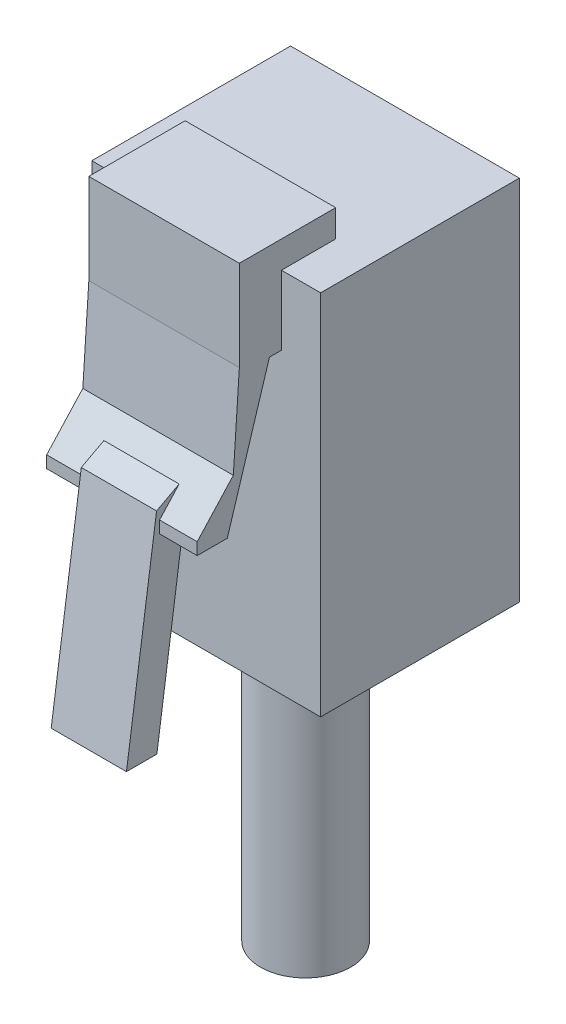
ISO-10303-21;
HEADER;
FILE_DESCRIPTION(('STEP AP214'),'2;1');
FILE_NAME('part.step','',(''),(''),'','','');
FILE_SCHEMA(('AUTOMOTIVE_DESIGN { 1 0 10303 214 1 1 1 1 }'));
ENDSEC;
DATA;
#1=APPLICATION_CONTEXT('core data for automotive mechanical design processes');
#2=APPLICATION_PROTOCOL_DEFINITION('international standard','automotive_design',2000,#1);
#3=PRODUCT_CONTEXT('',#1,'mechanical');
#4=PRODUCT('Part','Part','',(#3));
#5=PRODUCT_RELATED_PRODUCT_CATEGORY('part','',(#4));
#6=PRODUCT_DEFINITION_FORMATION('','',#4);
#7=PRODUCT_DEFINITION_CONTEXT('part definition',#1,'design');
#8=PRODUCT_DEFINITION('design','',#6,#7);
#9=PRODUCT_DEFINITION_SHAPE('','',#8);
#10=(LENGTH_UNIT() NAMED_UNIT(*) SI_UNIT(.MILLI.,.METRE.));
#11=(NAMED_UNIT(*) PLANE_ANGLE_UNIT() SI_UNIT($,.RADIAN.));
#12=(NAMED_UNIT(*) SI_UNIT($,.STERADIAN.) SOLID_ANGLE_UNIT());
#13=UNCERTAINTY_MEASURE_WITH_UNIT(LENGTH_MEASURE(1.E-05),#10,'distance_accuracy_value','');
#14=(GEOMETRIC_REPRESENTATION_CONTEXT(3) GLOBAL_UNCERTAINTY_ASSIGNED_CONTEXT((#13)) GLOBAL_UNIT_ASSIGNED_CONTEXT((#10,
#11,#12)) REPRESENTATION_CONTEXT('',''));
#15=CARTESIAN_POINT('',(0.,0.,0.));
#16=DIRECTION('',(0.,0.,1.));
#17=DIRECTION('',(1.,0.,0.));
#18=AXIS2_PLACEMENT_3D('',#15,#16,#17);
#19=CARTESIAN_POINT('',(-1.25,-7.,7.2));
#20=DIRECTION('',(0.,-1.,0.));
#21=DIRECTION('',(0.,0.,-1.));
#22=AXIS2_PLACEMENT_3D('',#19,#20,#21);
#23=PLANE('',#22);
#24=DIRECTION('',(1.,0.,0.));
#25=VECTOR('',#24,1.);
#26=CARTESIAN_POINT('',(-1.25,-7.,6.189847455448));
#27=LINE('',#26,#25);
#28=CARTESIAN_POINT('',(1.25,-7.,6.189847455448));
#29=VERTEX_POINT('',#28);
#30=CARTESIAN_POINT('',(-1.25,-7.,6.189847455448));
#31=VERTEX_POINT('',#30);
#32=EDGE_CURVE('E303',#29,#31,#27,.F.);
#33=ORIENTED_EDGE('',*,*,#32,.F.);
#34=DIRECTION('',(0.,0.,-1.));
#35=VECTOR('',#34,1.);
#36=CARTESIAN_POINT('',(1.25,-7.,0.));
#37=LINE('',#36,#35);
#38=CARTESIAN_POINT('',(1.25,-7.00000000000001,7.19999999999996));
#39=VERTEX_POINT('',#38);
#40=EDGE_CURVE('E315',#39,#29,#37,.T.);
#41=ORIENTED_EDGE('',*,*,#40,.F.);
#42=DIRECTION('',(1.,0.,0.));
#43=VECTOR('',#42,1.);
#44=CARTESIAN_POINT('',(-1.25,-7.00000000000002,7.1999999999999));
#45=LINE('',#44,#43);
#46=CARTESIAN_POINT('',(-1.25,-7.00000000000001,7.19999999999996));
#47=VERTEX_POINT('',#46);
#48=EDGE_CURVE('E308',#47,#39,#45,.T.);
#49=ORIENTED_EDGE('',*,*,#48,.F.);
#50=DIRECTION('',(0.,0.,-1.));
#51=VECTOR('',#50,1.);
#52=CARTESIAN_POINT('',(-1.25,-7.,0.));
#53=LINE('',#52,#51);
#54=EDGE_CURVE('E325',#47,#31,#53,.T.);
#55=ORIENTED_EDGE('',*,*,#54,.T.);
#56=EDGE_LOOP('',(#33,#41,#49,#55));
#57=FACE_BOUND('',#56,.T.);
#58=ADVANCED_FACE('F16',(#57),#23,.T.);
#59=CARTESIAN_POINT('',(-1.25,0.,0.));
#60=DIRECTION('',(1.,0.,0.));
#61=DIRECTION('',(0.,0.,-1.));
#62=AXIS2_PLACEMENT_3D('',#59,#60,#61);
#63=PLANE('',#62);
#64=DIRECTION('',(0.,0.989949493661169,-0.141421356237296));
#65=VECTOR('',#64,1.);
#66=CARTESIAN_POINT('',(-1.25,-7.,6.189847455448));
#67=LINE('',#66,#65);
#68=CARTESIAN_POINT('',(-1.25,-0.709999999999966,5.29127602687628));
#69=VERTEX_POINT('',#68);
#70=EDGE_CURVE('E300',#31,#69,#67,.T.);
#71=ORIENTED_EDGE('',*,*,#70,.F.);
#72=ORIENTED_EDGE('',*,*,#54,.F.);
#73=DIRECTION('',(0.,-0.989949493661169,0.141421356237296));
#74=VECTOR('',#73,1.);
#75=CARTESIAN_POINT('',(-1.25,0.,6.2));
#76=LINE('',#75,#74);
#77=CARTESIAN_POINT('',(-1.25,0.,6.20000000000003));
#78=VERTEX_POINT('',#77);
#79=EDGE_CURVE('E310',#78,#47,#76,.T.);
#80=ORIENTED_EDGE('',*,*,#79,.F.);
#81=DIRECTION('',(0.,-0.47045341325235,0.88242483303634));
#82=VECTOR('',#81,1.);
#83=CARTESIAN_POINT('',(-1.25,0.400110059428995,5.44951750281307));
#84=LINE('',#83,#82);
#85=CARTESIAN_POINT('',(-1.25,0.400110059429046,5.4495175028131));
#86=VERTEX_POINT('',#85);
#87=EDGE_CURVE('E170',#86,#78,#84,.T.);
#88=ORIENTED_EDGE('',*,*,#87,.F.);
#89=DIRECTION('',(0.,0.737387749170632,-0.675469693896824));
#90=VECTOR('',#89,1.);
#91=CARTESIAN_POINT('',(-1.25,-0.310000000000005,6.09999999999999));
#92=LINE('',#91,#90);
#93=CARTESIAN_POINT('',(-1.25,-0.310000000000012,6.09999999999999));
#94=VERTEX_POINT('',#93);
#95=EDGE_CURVE('E165',#94,#86,#92,.T.);
#96=ORIENTED_EDGE('',*,*,#95,.F.);
#97=DIRECTION('',(0.,1.,0.));
#98=VECTOR('',#97,1.);
#99=CARTESIAN_POINT('',(-1.25,0.,6.1));
#100=LINE('',#99,#98);
#101=CARTESIAN_POINT('',(-1.25,-0.709999999999988,6.1));
#102=VERTEX_POINT('',#101);
#103=EDGE_CURVE('E162',#102,#94,#100,.T.);
#104=ORIENTED_EDGE('',*,*,#103,.F.);
#105=DIRECTION('',(0.,0.,-1.));
#106=VECTOR('',#105,1.);
#107=CARTESIAN_POINT('',(-1.25,-0.709999999999977,0.));
#108=LINE('',#107,#106);
#109=EDGE_CURVE('E323',#69,#102,#108,.F.);
#110=ORIENTED_EDGE('',*,*,#109,.F.);
#111=EDGE_LOOP('',(#71,#72,#80,#88,#96,#104,#110));
#112=FACE_BOUND('',#111,.T.);
#113=ADVANCED_FACE('F168',(#112),#63,.F.);
#114=CARTESIAN_POINT('',(1.25,0.,0.));
#115=DIRECTION('',(1.,0.,0.));
#116=DIRECTION('',(0.,0.,-1.));
#117=AXIS2_PLACEMENT_3D('',#114,#115,#116);
#118=PLANE('',#117);
#119=DIRECTION('',(0.,0.989949493661169,-0.141421356237296));
#120=VECTOR('',#119,1.);
#121=CARTESIAN_POINT('',(1.25,-7.,6.189847455448));
#122=LINE('',#121,#120);
#123=CARTESIAN_POINT('',(1.25,-0.709999999999965,5.29127602687628));
#124=VERTEX_POINT('',#123);
#125=EDGE_CURVE('E297',#124,#29,#122,.F.);
#126=ORIENTED_EDGE('',*,*,#125,.F.);
#127=DIRECTION('',(0.,0.,-1.));
#128=VECTOR('',#127,1.);
#129=CARTESIAN_POINT('',(1.25,-0.709999999999977,0.));
#130=LINE('',#129,#128);
#131=CARTESIAN_POINT('',(1.25,-0.709999999999988,6.1));
#132=VERTEX_POINT('',#131);
#133=EDGE_CURVE('E313',#124,#132,#130,.F.);
#134=ORIENTED_EDGE('',*,*,#133,.T.);
#135=DIRECTION('',(0.,1.,0.));
#136=VECTOR('',#135,1.);
#137=CARTESIAN_POINT('',(1.25,0.,6.1));
#138=LINE('',#137,#136);
#139=CARTESIAN_POINT('',(1.25,-0.310000000000013,6.09999999999999));
#140=VERTEX_POINT('',#139);
#141=EDGE_CURVE('E321',#132,#140,#138,.T.);
#142=ORIENTED_EDGE('',*,*,#141,.T.);
#143=DIRECTION('',(0.,0.737387749170632,-0.675469693896824));
#144=VECTOR('',#143,1.);
#145=CARTESIAN_POINT('',(1.25,-0.310000000000005,6.09999999999999));
#146=LINE('',#145,#144);
#147=CARTESIAN_POINT('',(1.25,0.400110059429046,5.4495175028131));
#148=VERTEX_POINT('',#147);
#149=EDGE_CURVE('E319',#140,#148,#146,.T.);
#150=ORIENTED_EDGE('',*,*,#149,.T.);
#151=DIRECTION('',(0.,-0.47045341325235,0.88242483303634));
#152=VECTOR('',#151,1.);
#153=CARTESIAN_POINT('',(1.25,0.400110059428995,5.44951750281307));
#154=LINE('',#153,#152);
#155=CARTESIAN_POINT('',(1.25,0.,6.20000000000003));
#156=VERTEX_POINT('',#155);
#157=EDGE_CURVE('E317',#148,#156,#154,.T.);
#158=ORIENTED_EDGE('',*,*,#157,.T.);
#159=DIRECTION('',(0.,-0.989949493661169,0.141421356237296));
#160=VECTOR('',#159,1.);
#161=CARTESIAN_POINT('',(1.25,0.,6.2));
#162=LINE('',#161,#160);
#163=EDGE_CURVE('E305',#39,#156,#162,.F.);
#164=ORIENTED_EDGE('',*,*,#163,.F.);
#165=ORIENTED_EDGE('',*,*,#40,.T.);
#166=EDGE_LOOP('',(#126,#134,#142,#150,#158,#164,#165));
#167=FACE_BOUND('',#166,.T.);
#168=ADVANCED_FACE('F338',(#167),#118,.T.);
#169=CARTESIAN_POINT('',(-1.25,0.,6.2));
#170=DIRECTION('',(0.,0.141421356237296,0.989949493661169));
#171=DIRECTION('',(0.,-0.989949493661169,0.141421356237296));
#172=AXIS2_PLACEMENT_3D('',#169,#170,#171);
#173=PLANE('',#172);
#174=ORIENTED_EDGE('',*,*,#48,.T.);
#175=ORIENTED_EDGE('',*,*,#163,.T.);
#176=DIRECTION('',(1.,0.,0.));
#177=VECTOR('',#176,1.);
#178=CARTESIAN_POINT('',(-1.25,1.75640751942652E-13,6.20000000000009));
#179=LINE('',#178,#177);
#180=EDGE_CURVE('E294',#78,#156,#179,.T.);
#181=ORIENTED_EDGE('',*,*,#180,.F.);
#182=ORIENTED_EDGE('',*,*,#79,.T.);
#183=EDGE_LOOP('',(#174,#175,#181,#182));
#184=FACE_BOUND('',#183,.T.);
#185=ADVANCED_FACE('F333',(#184),#173,.T.);
#186=CARTESIAN_POINT('',(-1.25,-7.,6.189847455448));
#187=DIRECTION('',(0.,-0.141421356237296,-0.989949493661169));
#188=DIRECTION('',(0.,0.989949493661169,-0.141421356237296));
#189=AXIS2_PLACEMENT_3D('',#186,#187,#188);
#190=PLANE('',#189);
#191=DIRECTION('',(1.,0.,0.));
#192=VECTOR('',#191,1.);
#193=CARTESIAN_POINT('',(-2.5,-0.71,5.29127602687616));
#194=LINE('',#193,#192);
#195=EDGE_CURVE('E291',#124,#69,#194,.F.);
#196=ORIENTED_EDGE('',*,*,#195,.F.);
#197=ORIENTED_EDGE('',*,*,#125,.T.);
#198=ORIENTED_EDGE('',*,*,#32,.T.);
#199=ORIENTED_EDGE('',*,*,#70,.T.);
#200=EDGE_LOOP('',(#196,#197,#198,#199));
#201=FACE_BOUND('',#200,.T.);
#202=ADVANCED_FACE('F366',(#201),#190,.T.);
#203=CARTESIAN_POINT('',(-1.25,0.5829485822809,5.106569086551));
#204=DIRECTION('',(0.,0.882424833036311,0.470453413252406));
#205=DIRECTION('',(0.,-0.470453413252406,0.882424833036311));
#206=AXIS2_PLACEMENT_3D('',#203,#204,#205);
#207=PLANE('',#206);
#208=ORIENTED_EDGE('',*,*,#87,.T.);
#209=ORIENTED_EDGE('',*,*,#180,.T.);
#210=ORIENTED_EDGE('',*,*,#157,.F.);
#211=DIRECTION('',(1.,0.,0.));
#212=VECTOR('',#211,1.);
#213=CARTESIAN_POINT('',(-2.5,0.40011005942902,5.44951750281309));
#214=LINE('',#213,#212);
#215=EDGE_CURVE('E183',#86,#148,#214,.T.);
#216=ORIENTED_EDGE('',*,*,#215,.F.);
#217=EDGE_LOOP('',(#208,#209,#210,#216));
#218=FACE_BOUND('',#217,.T.);
#219=ADVANCED_FACE('F328',(#218),#207,.T.);
#220=CARTESIAN_POINT('',(-2.5,-0.71,6.1));
#221=DIRECTION('',(0.,-1.,0.));
#222=DIRECTION('',(0.,0.,-1.));
#223=AXIS2_PLACEMENT_3D('',#220,#221,#222);
#224=PLANE('',#223);
#225=DIRECTION('',(1.,0.,0.));
#226=VECTOR('',#225,1.);
#227=CARTESIAN_POINT('',(-2.5,-0.71,6.1));
#228=LINE('',#227,#226);
#229=CARTESIAN_POINT('',(2.5,-0.71,6.1));
#230=VERTEX_POINT('',#229);
#231=EDGE_CURVE('E274',#132,#230,#228,.T.);
#232=ORIENTED_EDGE('',*,*,#231,.F.);
#233=ORIENTED_EDGE('',*,*,#133,.F.);
#234=ORIENTED_EDGE('',*,*,#195,.T.);
#235=ORIENTED_EDGE('',*,*,#109,.T.);
#236=DIRECTION('',(1.,0.,0.));
#237=VECTOR('',#236,1.);
#238=CARTESIAN_POINT('',(-2.5,-0.71,6.1));
#239=LINE('',#238,#237);
#240=CARTESIAN_POINT('',(-2.5,-0.71,6.1));
#241=VERTEX_POINT('',#240);
#242=EDGE_CURVE('E188',#241,#102,#239,.T.);
#243=ORIENTED_EDGE('',*,*,#242,.F.);
#244=DIRECTION('',(0.,0.,-1.));
#245=VECTOR('',#244,1.);
#246=CARTESIAN_POINT('',(-2.5,-0.71,6.1));
#247=LINE('',#246,#245);
#248=CARTESIAN_POINT('',(-2.5,-0.71,5.1));
#249=VERTEX_POINT('',#248);
#250=EDGE_CURVE('E289',#241,#249,#247,.T.);
#251=ORIENTED_EDGE('',*,*,#250,.T.);
#252=DIRECTION('',(1.,0.,0.));
#253=VECTOR('',#252,1.);
#254=CARTESIAN_POINT('',(-2.5,-0.71,5.1));
#255=LINE('',#254,#253);
#256=CARTESIAN_POINT('',(2.5,-0.71,5.1));
#257=VERTEX_POINT('',#256);
#258=EDGE_CURVE('E271',#257,#249,#255,.F.);
#259=ORIENTED_EDGE('',*,*,#258,.F.);
#260=DIRECTION('',(0.,0.,-1.));
#261=VECTOR('',#260,1.);
#262=CARTESIAN_POINT('',(2.5,-0.71,6.1));
#263=LINE('',#262,#261);
#264=EDGE_CURVE('E287',#257,#230,#263,.F.);
#265=ORIENTED_EDGE('',*,*,#264,.T.);
#266=EDGE_LOOP('',(#232,#233,#234,#235,#243,#251,#259,#265));
#267=FACE_BOUND('',#266,.T.);
#268=ADVANCED_FACE('F363',(#267),#224,.T.);
#269=CARTESIAN_POINT('',(-2.5,-0.31,6.1));
#270=DIRECTION('',(0.,0.,1.));
#271=DIRECTION('',(1.,0.,0.));
#272=AXIS2_PLACEMENT_3D('',#269,#270,#271);
#273=PLANE('',#272);
#274=DIRECTION('',(1.,0.,0.));
#275=VECTOR('',#274,1.);
#276=CARTESIAN_POINT('',(-2.5,-0.310000000000021,6.09999999999998));
#277=LINE('',#276,#275);
#278=CARTESIAN_POINT('',(-2.5,-0.310000000000015,6.09999999999999));
#279=VERTEX_POINT('',#278);
#280=EDGE_CURVE('E176',#279,#94,#277,.T.);
#281=ORIENTED_EDGE('',*,*,#280,.F.);
#282=DIRECTION('',(0.,1.,0.));
#283=VECTOR('',#282,1.);
#284=CARTESIAN_POINT('',(-2.5,0.,6.09999999999999));
#285=LINE('',#284,#283);
#286=EDGE_CURVE('E254',#279,#241,#285,.F.);
#287=ORIENTED_EDGE('',*,*,#286,.T.);
#288=ORIENTED_EDGE('',*,*,#242,.T.);
#289=ORIENTED_EDGE('',*,*,#103,.T.);
#290=EDGE_LOOP('',(#281,#287,#288,#289));
#291=FACE_BOUND('',#290,.T.);
#292=ADVANCED_FACE('F186',(#291),#273,.T.);
#293=CARTESIAN_POINT('',(-2.5,7.,1.5));
#294=DIRECTION('',(0.,1.,0.));
#295=DIRECTION('',(0.,0.,1.));
#296=AXIS2_PLACEMENT_3D('',#293,#294,#295);
#297=PLANE('',#296);
#298=DIRECTION('',(1.,0.,0.));
#299=VECTOR('',#298,1.);
#300=CARTESIAN_POINT('',(-2.5,7.,4.7));
#301=LINE('',#300,#299);
#302=CARTESIAN_POINT('',(2.5,7.,4.7));
#303=VERTEX_POINT('',#302);
#304=CARTESIAN_POINT('',(-2.5,7.,4.7));
#305=VERTEX_POINT('',#304);
#306=EDGE_CURVE('E284',#303,#305,#301,.F.);
#307=ORIENTED_EDGE('',*,*,#306,.F.);
#308=DIRECTION('',(0.,0.,-1.));
#309=VECTOR('',#308,1.);
#310=CARTESIAN_POINT('',(2.5,7.,0.));
#311=LINE('',#310,#309);
#312=CARTESIAN_POINT('',(2.5,7.,1.5));
#313=VERTEX_POINT('',#312);
#314=EDGE_CURVE('E239',#313,#303,#311,.F.);
#315=ORIENTED_EDGE('',*,*,#314,.F.);
#316=DIRECTION('',(-1.,0.,0.));
#317=VECTOR('',#316,1.);
#318=CARTESIAN_POINT('',(-2.5,7.,1.5));
#319=LINE('',#318,#317);
#320=CARTESIAN_POINT('',(-2.5,7.,1.5));
#321=VERTEX_POINT('',#320);
#322=EDGE_CURVE('E246',#321,#313,#319,.F.);
#323=ORIENTED_EDGE('',*,*,#322,.F.);
#324=DIRECTION('',(0.,0.,-1.));
#325=VECTOR('',#324,1.);
#326=CARTESIAN_POINT('',(-2.5,7.,0.));
#327=LINE('',#326,#325);
#328=EDGE_CURVE('E263',#321,#305,#327,.F.);
#329=ORIENTED_EDGE('',*,*,#328,.T.);
#330=EDGE_LOOP('',(#307,#315,#323,#329));
#331=FACE_BOUND('',#330,.T.);
#332=ADVANCED_FACE('F433',(#331),#297,.T.);
#333=CARTESIAN_POINT('',(-2.5,7.,4.7));
#334=DIRECTION('',(0.,0.,1.));
#335=DIRECTION('',(1.,0.,0.));
#336=AXIS2_PLACEMENT_3D('',#333,#334,#335);
#337=PLANE('',#336);
#338=DIRECTION('',(1.,0.,0.));
#339=VECTOR('',#338,1.);
#340=CARTESIAN_POINT('',(-2.5,3.99999999999995,4.7));
#341=LINE('',#340,#339);
#342=CARTESIAN_POINT('',(2.5,3.99999999999995,4.7));
#343=VERTEX_POINT('',#342);
#344=CARTESIAN_POINT('',(-2.5,3.99999999999995,4.7));
#345=VERTEX_POINT('',#344);
#346=EDGE_CURVE('E184',#343,#345,#341,.F.);
#347=ORIENTED_EDGE('',*,*,#346,.F.);
#348=DIRECTION('',(0.,1.,0.));
#349=VECTOR('',#348,1.);
#350=CARTESIAN_POINT('',(2.5,0.,4.7));
#351=LINE('',#350,#349);
#352=EDGE_CURVE('E237',#303,#343,#351,.F.);
#353=ORIENTED_EDGE('',*,*,#352,.F.);
#354=ORIENTED_EDGE('',*,*,#306,.T.);
#355=DIRECTION('',(0.,1.,0.));
#356=VECTOR('',#355,1.);
#357=CARTESIAN_POINT('',(-2.5,0.,4.7));
#358=LINE('',#357,#356);
#359=EDGE_CURVE('E260',#305,#345,#358,.F.);
#360=ORIENTED_EDGE('',*,*,#359,.T.);
#361=EDGE_LOOP('',(#347,#353,#354,#360));
#362=FACE_BOUND('',#361,.T.);
#363=ADVANCED_FACE('F430',(#362),#337,.T.);
#364=CARTESIAN_POINT('',(-2.5,4.,4.7));
#365=DIRECTION('',(0.,0.0665190105237706,0.997785157856609));
#366=DIRECTION('',(0.,-0.997785157856609,0.0665190105237706));
#367=AXIS2_PLACEMENT_3D('',#364,#365,#366);
#368=PLANE('',#367);
#369=DIRECTION('',(1.,0.,0.));
#370=VECTOR('',#369,1.);
#371=CARTESIAN_POINT('',(-2.5,1.,4.9));
#372=LINE('',#371,#370);
#373=CARTESIAN_POINT('',(2.5,1.,4.89999999999999));
#374=VERTEX_POINT('',#373);
#375=CARTESIAN_POINT('',(-2.5,1.,4.89999999999999));
#376=VERTEX_POINT('',#375);
#377=EDGE_CURVE('E280',#374,#376,#372,.F.);
#378=ORIENTED_EDGE('',*,*,#377,.F.);
#379=DIRECTION('',(0.,-0.997785157856609,0.0665190105237731));
#380=VECTOR('',#379,1.);
#381=CARTESIAN_POINT('',(2.5,3.99999999999995,4.7));
#382=LINE('',#381,#380);
#383=EDGE_CURVE('E235',#343,#374,#382,.T.);
#384=ORIENTED_EDGE('',*,*,#383,.F.);
#385=ORIENTED_EDGE('',*,*,#346,.T.);
#386=DIRECTION('',(0.,-0.997785157856609,0.0665190105237731));
#387=VECTOR('',#386,1.);
#388=CARTESIAN_POINT('',(-2.5,3.99999999999995,4.7));
#389=LINE('',#388,#387);
#390=EDGE_CURVE('E257',#345,#376,#389,.T.);
#391=ORIENTED_EDGE('',*,*,#390,.T.);
#392=EDGE_LOOP('',(#378,#384,#385,#391));
#393=FACE_BOUND('',#392,.T.);
#394=ADVANCED_FACE('F355',(#393),#368,.T.);
#395=CARTESIAN_POINT('',(-2.5,1.,4.9));
#396=DIRECTION('',(0.,0.675469693896777,0.737387749170675));
#397=DIRECTION('',(0.,-0.737387749170675,0.675469693896777));
#398=AXIS2_PLACEMENT_3D('',#395,#396,#397);
#399=PLANE('',#398);
#400=ORIENTED_EDGE('',*,*,#377,.T.);
#401=DIRECTION('',(0.,-0.737387749170667,0.675469693896785));
#402=VECTOR('',#401,1.);
#403=CARTESIAN_POINT('',(-2.5,0.999999999999999,4.9));
#404=LINE('',#403,#402);
#405=EDGE_CURVE('E179',#376,#279,#404,.T.);
#406=ORIENTED_EDGE('',*,*,#405,.T.);
#407=ORIENTED_EDGE('',*,*,#280,.T.);
#408=ORIENTED_EDGE('',*,*,#95,.T.);
#409=ORIENTED_EDGE('',*,*,#215,.T.);
#410=ORIENTED_EDGE('',*,*,#149,.F.);
#411=DIRECTION('',(1.,0.,0.));
#412=VECTOR('',#411,1.);
#413=CARTESIAN_POINT('',(-2.5,-0.310000000000011,6.1));
#414=LINE('',#413,#412);
#415=CARTESIAN_POINT('',(2.5,-0.310000000000016,6.09999999999999));
#416=VERTEX_POINT('',#415);
#417=EDGE_CURVE('E277',#416,#140,#414,.F.);
#418=ORIENTED_EDGE('',*,*,#417,.F.);
#419=DIRECTION('',(0.,-0.737387749170667,0.675469693896785));
#420=VECTOR('',#419,1.);
#421=CARTESIAN_POINT('',(2.5,0.999999999999999,4.9));
#422=LINE('',#421,#420);
#423=EDGE_CURVE('E233',#374,#416,#422,.T.);
#424=ORIENTED_EDGE('',*,*,#423,.F.);
#425=EDGE_LOOP('',(#400,#406,#407,#408,#409,#410,#418,#424));
#426=FACE_BOUND('',#425,.T.);
#427=ADVANCED_FACE('F177',(#426),#399,.T.);
#428=CARTESIAN_POINT('',(-2.5,-0.31,6.1));
#429=DIRECTION('',(0.,0.,1.));
#430=DIRECTION('',(1.,0.,0.));
#431=AXIS2_PLACEMENT_3D('',#428,#429,#430);
#432=PLANE('',#431);
#433=ORIENTED_EDGE('',*,*,#231,.T.);
#434=DIRECTION('',(0.,1.,0.));
#435=VECTOR('',#434,1.);
#436=CARTESIAN_POINT('',(2.5,0.,6.09999999999999));
#437=LINE('',#436,#435);
#438=EDGE_CURVE('E230',#416,#230,#437,.F.);
#439=ORIENTED_EDGE('',*,*,#438,.F.);
#440=ORIENTED_EDGE('',*,*,#417,.T.);
#441=ORIENTED_EDGE('',*,*,#141,.F.);
#442=EDGE_LOOP('',(#433,#439,#440,#441));
#443=FACE_BOUND('',#442,.T.);
#444=ADVANCED_FACE('F345',(#443),#432,.T.);
#445=CARTESIAN_POINT('',(-2.5,-0.71,5.1));
#446=DIRECTION('',(0.,-0.296465820200513,-0.955043463645942));
#447=DIRECTION('',(0.,0.955043463645942,-0.296465820200513));
#448=AXIS2_PLACEMENT_3D('',#445,#446,#447);
#449=PLANE('',#448);
#450=DIRECTION('',(1.,0.,0.));
#451=VECTOR('',#450,1.);
#452=CARTESIAN_POINT('',(-2.5,3.8,3.7));
#453=LINE('',#452,#451);
#454=CARTESIAN_POINT('',(2.5,3.8,3.7));
#455=VERTEX_POINT('',#454);
#456=CARTESIAN_POINT('',(-2.5,3.8,3.7));
#457=VERTEX_POINT('',#456);
#458=EDGE_CURVE('E269',#455,#457,#453,.F.);
#459=ORIENTED_EDGE('',*,*,#458,.F.);
#460=DIRECTION('',(0.,0.955043463645941,-0.296465820200514));
#461=VECTOR('',#460,1.);
#462=CARTESIAN_POINT('',(2.5,-0.71,5.1));
#463=LINE('',#462,#461);
#464=EDGE_CURVE('E227',#257,#455,#463,.T.);
#465=ORIENTED_EDGE('',*,*,#464,.F.);
#466=ORIENTED_EDGE('',*,*,#258,.T.);
#467=DIRECTION('',(0.,0.955043463645941,-0.296465820200514));
#468=VECTOR('',#467,1.);
#469=CARTESIAN_POINT('',(-2.5,-0.71,5.1));
#470=LINE('',#469,#468);
#471=EDGE_CURVE('E251',#249,#457,#470,.T.);
#472=ORIENTED_EDGE('',*,*,#471,.T.);
#473=EDGE_LOOP('',(#459,#465,#466,#472));
#474=FACE_BOUND('',#473,.T.);
#475=ADVANCED_FACE('F419',(#474),#449,.T.);
#476=CARTESIAN_POINT('',(0.,-16.1,-3.3));
#477=DIRECTION('',(0.,-1.,0.));
#478=DIRECTION('',(0.,0.,-1.));
#479=AXIS2_PLACEMENT_3D('',#476,#477,#478);
#480=PLANE('',#479);
#481=CARTESIAN_POINT('',(0.,-16.1,0.));
#482=DIRECTION('',(0.,-1.,0.));
#483=DIRECTION('',(0.,0.,-1.));
#484=AXIS2_PLACEMENT_3D('',#481,#482,#483);
#485=CIRCLE('',#484,1.5);
#486=CARTESIAN_POINT('',(0.,-16.1,-1.5));
#487=VERTEX_POINT('',#486);
#488=EDGE_CURVE('E19',#487,#487,#485,.F.);
#489=ORIENTED_EDGE('',*,*,#488,.F.);
#490=EDGE_LOOP('',(#489));
#491=FACE_BOUND('',#490,.T.);
#492=ADVANCED_FACE('F415',(#491),#480,.T.);
#493=CARTESIAN_POINT('',(-2.5,3.8,3.7));
#494=DIRECTION('',(0.,-1.,0.));
#495=DIRECTION('',(0.,0.,-1.));
#496=AXIS2_PLACEMENT_3D('',#493,#494,#495);
#497=PLANE('',#496);
#498=DIRECTION('',(0.,0.,-1.));
#499=VECTOR('',#498,1.);
#500=CARTESIAN_POINT('',(2.5,3.8,0.));
#501=LINE('',#500,#499);
#502=CARTESIAN_POINT('',(2.5,3.8,3.3));
#503=VERTEX_POINT('',#502);
#504=EDGE_CURVE('E244',#455,#503,#501,.T.);
#505=ORIENTED_EDGE('',*,*,#504,.F.);
#506=ORIENTED_EDGE('',*,*,#458,.T.);
#507=DIRECTION('',(0.,0.,-1.));
#508=VECTOR('',#507,1.);
#509=CARTESIAN_POINT('',(-2.5,3.8,0.));
#510=LINE('',#509,#508);
#511=CARTESIAN_POINT('',(-2.5,3.8,3.3));
#512=VERTEX_POINT('',#511);
#513=EDGE_CURVE('E266',#457,#512,#510,.T.);
#514=ORIENTED_EDGE('',*,*,#513,.T.);
#515=DIRECTION('',(1.,0.,0.));
#516=VECTOR('',#515,1.);
#517=CARTESIAN_POINT('',(0.,3.8,3.3));
#518=LINE('',#517,#516);
#519=EDGE_CURVE('E225',#503,#512,#518,.F.);
#520=ORIENTED_EDGE('',*,*,#519,.F.);
#521=EDGE_LOOP('',(#505,#506,#514,#520));
#522=FACE_BOUND('',#521,.T.);
#523=ADVANCED_FACE('F412',(#522),#497,.T.);
#524=CARTESIAN_POINT('',(-2.5,0.,0.));
#525=DIRECTION('',(1.,0.,0.));
#526=DIRECTION('',(0.,0.,-1.));
#527=AXIS2_PLACEMENT_3D('',#524,#525,#526);
#528=PLANE('',#527);
#529=ORIENTED_EDGE('',*,*,#250,.F.);
#530=ORIENTED_EDGE('',*,*,#286,.F.);
#531=ORIENTED_EDGE('',*,*,#405,.F.);
#532=ORIENTED_EDGE('',*,*,#390,.F.);
#533=ORIENTED_EDGE('',*,*,#359,.F.);
#534=ORIENTED_EDGE('',*,*,#328,.F.);
#535=DIRECTION('',(0.,1.,0.));
#536=VECTOR('',#535,1.);
#537=CARTESIAN_POINT('',(-2.5,3.8,1.5));
#538=LINE('',#537,#536);
#539=CARTESIAN_POINT('',(-2.5,6.1,1.5));
#540=VERTEX_POINT('',#539);
#541=EDGE_CURVE('E248',#540,#321,#538,.T.);
#542=ORIENTED_EDGE('',*,*,#541,.F.);
#543=DIRECTION('',(0.,0.,1.));
#544=VECTOR('',#543,1.);
#545=CARTESIAN_POINT('',(-2.5,6.1,-3.3));
#546=LINE('',#545,#544);
#547=CARTESIAN_POINT('',(-2.5,6.1,3.3));
#548=VERTEX_POINT('',#547);
#549=EDGE_CURVE('E215',#548,#540,#546,.F.);
#550=ORIENTED_EDGE('',*,*,#549,.F.);
#551=DIRECTION('',(0.,1.,0.));
#552=VECTOR('',#551,1.);
#553=CARTESIAN_POINT('',(-2.5,0.,3.3));
#554=LINE('',#553,#552);
#555=EDGE_CURVE('E223',#512,#548,#554,.T.);
#556=ORIENTED_EDGE('',*,*,#555,.F.);
#557=ORIENTED_EDGE('',*,*,#513,.F.);
#558=ORIENTED_EDGE('',*,*,#471,.F.);
#559=EDGE_LOOP('',(#529,#530,#531,#532,#533,#534,#542,#550,#556,#557,#558));
#560=FACE_BOUND('',#559,.T.);
#561=ADVANCED_FACE('F358',(#560),#528,.F.);
#562=CARTESIAN_POINT('',(-2.5,3.8,1.5));
#563=DIRECTION('',(0.,0.,-1.));
#564=DIRECTION('',(-1.,0.,0.));
#565=AXIS2_PLACEMENT_3D('',#562,#563,#564);
#566=PLANE('',#565);
#567=ORIENTED_EDGE('',*,*,#541,.T.);
#568=ORIENTED_EDGE('',*,*,#322,.T.);
#569=DIRECTION('',(0.,1.,0.));
#570=VECTOR('',#569,1.);
#571=CARTESIAN_POINT('',(2.5,0.,1.5));
#572=LINE('',#571,#570);
#573=CARTESIAN_POINT('',(2.5,6.1,1.5));
#574=VERTEX_POINT('',#573);
#575=EDGE_CURVE('E241',#574,#313,#572,.T.);
#576=ORIENTED_EDGE('',*,*,#575,.F.);
#577=DIRECTION('',(1.,0.,0.));
#578=VECTOR('',#577,1.);
#579=CARTESIAN_POINT('',(3.8,6.1,1.5));
#580=LINE('',#579,#578);
#581=EDGE_CURVE('E213',#540,#574,#580,.T.);
#582=ORIENTED_EDGE('',*,*,#581,.F.);
#583=EDGE_LOOP('',(#567,#568,#576,#582));
#584=FACE_BOUND('',#583,.T.);
#585=ADVANCED_FACE('F406',(#584),#566,.T.);
#586=CARTESIAN_POINT('',(2.5,0.,0.));
#587=DIRECTION('',(1.,0.,0.));
#588=DIRECTION('',(0.,0.,-1.));
#589=AXIS2_PLACEMENT_3D('',#586,#587,#588);
#590=PLANE('',#589);
#591=ORIENTED_EDGE('',*,*,#264,.F.);
#592=ORIENTED_EDGE('',*,*,#464,.T.);
#593=ORIENTED_EDGE('',*,*,#504,.T.);
#594=DIRECTION('',(0.,1.,0.));
#595=VECTOR('',#594,1.);
#596=CARTESIAN_POINT('',(2.5,0.,3.3));
#597=LINE('',#596,#595);
#598=CARTESIAN_POINT('',(2.5,6.1,3.3));
#599=VERTEX_POINT('',#598);
#600=EDGE_CURVE('E220',#599,#503,#597,.F.);
#601=ORIENTED_EDGE('',*,*,#600,.F.);
#602=DIRECTION('',(0.,0.,1.));
#603=VECTOR('',#602,1.);
#604=CARTESIAN_POINT('',(2.5,6.1,-3.3));
#605=LINE('',#604,#603);
#606=EDGE_CURVE('E211',#574,#599,#605,.T.);
#607=ORIENTED_EDGE('',*,*,#606,.F.);
#608=ORIENTED_EDGE('',*,*,#575,.T.);
#609=ORIENTED_EDGE('',*,*,#314,.T.);
#610=ORIENTED_EDGE('',*,*,#352,.T.);
#611=ORIENTED_EDGE('',*,*,#383,.T.);
#612=ORIENTED_EDGE('',*,*,#423,.T.);
#613=ORIENTED_EDGE('',*,*,#438,.T.);
#614=EDGE_LOOP('',(#591,#592,#593,#601,#607,#608,#609,#610,#611,#612,#613));
#615=FACE_BOUND('',#614,.T.);
#616=ADVANCED_FACE('F348',(#615),#590,.T.);
#617=CARTESIAN_POINT('',(0.,-6.1,0.));
#618=DIRECTION('',(0.,-1.,0.));
#619=DIRECTION('',(0.,0.,-1.));
#620=AXIS2_PLACEMENT_3D('',#617,#618,#619);
#621=CYLINDRICAL_SURFACE('',#620,1.5);
#622=ORIENTED_EDGE('',*,*,#488,.T.);
#623=EDGE_LOOP('',(#622));
#624=FACE_BOUND('',#623,.T.);
#625=CARTESIAN_POINT('',(0.,-6.1,0.));
#626=DIRECTION('',(0.,-1.,0.));
#627=DIRECTION('',(0.,0.,-1.));
#628=AXIS2_PLACEMENT_3D('',#625,#626,#627);
#629=CIRCLE('',#628,1.5);
#630=CARTESIAN_POINT('',(0.,-6.1,-1.5));
#631=VERTEX_POINT('',#630);
#632=EDGE_CURVE('E192',#631,#631,#629,.F.);
#633=ORIENTED_EDGE('',*,*,#632,.F.);
#634=EDGE_LOOP('',(#633));
#635=FACE_BOUND('',#634,.T.);
#636=ADVANCED_FACE('F399',(#624,#635),#621,.T.);
#637=CARTESIAN_POINT('',(0.,0.,3.3));
#638=DIRECTION('',(0.,0.,1.));
#639=DIRECTION('',(1.,0.,0.));
#640=AXIS2_PLACEMENT_3D('',#637,#638,#639);
#641=PLANE('',#640);
#642=DIRECTION('',(1.,0.,0.));
#643=VECTOR('',#642,1.);
#644=CARTESIAN_POINT('',(3.8,6.1,3.3));
#645=LINE('',#644,#643);
#646=CARTESIAN_POINT('',(3.8,6.1,3.3));
#647=VERTEX_POINT('',#646);
#648=EDGE_CURVE('E206',#599,#647,#645,.T.);
#649=ORIENTED_EDGE('',*,*,#648,.F.);
#650=ORIENTED_EDGE('',*,*,#600,.T.);
#651=ORIENTED_EDGE('',*,*,#519,.T.);
#652=ORIENTED_EDGE('',*,*,#555,.T.);
#653=DIRECTION('',(1.,0.,0.));
#654=VECTOR('',#653,1.);
#655=CARTESIAN_POINT('',(3.8,6.1,3.3));
#656=LINE('',#655,#654);
#657=CARTESIAN_POINT('',(-3.8,6.1,3.3));
#658=VERTEX_POINT('',#657);
#659=EDGE_CURVE('E217',#658,#548,#656,.T.);
#660=ORIENTED_EDGE('',*,*,#659,.F.);
#661=DIRECTION('',(0.,1.,0.));
#662=VECTOR('',#661,1.);
#663=CARTESIAN_POINT('',(-3.8,6.1,3.3));
#664=LINE('',#663,#662);
#665=CARTESIAN_POINT('',(-3.8,-6.1,3.3));
#666=VERTEX_POINT('',#665);
#667=EDGE_CURVE('E195',#666,#658,#664,.T.);
#668=ORIENTED_EDGE('',*,*,#667,.F.);
#669=DIRECTION('',(1.,0.,0.));
#670=VECTOR('',#669,1.);
#671=CARTESIAN_POINT('',(-3.8,-6.1,3.3));
#672=LINE('',#671,#670);
#673=CARTESIAN_POINT('',(3.8,-6.1,3.3));
#674=VERTEX_POINT('',#673);
#675=EDGE_CURVE('E198',#674,#666,#672,.F.);
#676=ORIENTED_EDGE('',*,*,#675,.F.);
#677=DIRECTION('',(0.,1.,0.));
#678=VECTOR('',#677,1.);
#679=CARTESIAN_POINT('',(3.8,-6.1,3.3));
#680=LINE('',#679,#678);
#681=EDGE_CURVE('E570',#647,#674,#680,.F.);
#682=ORIENTED_EDGE('',*,*,#681,.F.);
#683=EDGE_LOOP('',(#649,#650,#651,#652,#660,#668,#676,#682));
#684=FACE_BOUND('',#683,.T.);
#685=ADVANCED_FACE('F395',(#684),#641,.T.);
#686=CARTESIAN_POINT('',(3.8,6.1,-3.3));
#687=DIRECTION('',(0.,1.,0.));
#688=DIRECTION('',(0.,0.,1.));
#689=AXIS2_PLACEMENT_3D('',#686,#687,#688);
#690=PLANE('',#689);
#691=DIRECTION('',(1.,0.,0.));
#692=VECTOR('',#691,1.);
#693=CARTESIAN_POINT('',(0.,6.1,-3.3));
#694=LINE('',#693,#692);
#695=CARTESIAN_POINT('',(3.8,6.1,-3.3));
#696=VERTEX_POINT('',#695);
#697=CARTESIAN_POINT('',(-3.8,6.1,-3.3));
#698=VERTEX_POINT('',#697);
#699=EDGE_CURVE('E575',#696,#698,#694,.F.);
#700=ORIENTED_EDGE('',*,*,#699,.T.);
#701=DIRECTION('',(0.,0.,1.));
#702=VECTOR('',#701,1.);
#703=CARTESIAN_POINT('',(-3.8,6.1,-3.3));
#704=LINE('',#703,#702);
#705=EDGE_CURVE('E201',#658,#698,#704,.F.);
#706=ORIENTED_EDGE('',*,*,#705,.F.);
#707=ORIENTED_EDGE('',*,*,#659,.T.);
#708=ORIENTED_EDGE('',*,*,#549,.T.);
#709=ORIENTED_EDGE('',*,*,#581,.T.);
#710=ORIENTED_EDGE('',*,*,#606,.T.);
#711=ORIENTED_EDGE('',*,*,#648,.T.);
#712=DIRECTION('',(0.,0.,-1.));
#713=VECTOR('',#712,1.);
#714=CARTESIAN_POINT('',(3.8,6.1,-3.3));
#715=LINE('',#714,#713);
#716=EDGE_CURVE('E573',#696,#647,#715,.F.);
#717=ORIENTED_EDGE('',*,*,#716,.F.);
#718=EDGE_LOOP('',(#700,#706,#707,#708,#709,#710,#711,#717));
#719=FACE_BOUND('',#718,.T.);
#720=ADVANCED_FACE('F392',(#719),#690,.T.);
#721=CARTESIAN_POINT('',(-3.8,6.1,-3.3));
#722=DIRECTION('',(-1.,0.,0.));
#723=DIRECTION('',(0.,0.,1.));
#724=AXIS2_PLACEMENT_3D('',#721,#722,#723);
#725=PLANE('',#724);
#726=DIRECTION('',(0.,0.,-1.));
#727=VECTOR('',#726,1.);
#728=CARTESIAN_POINT('',(-3.8,-6.1,-3.3));
#729=LINE('',#728,#727);
#730=CARTESIAN_POINT('',(-3.8,-6.1,-3.3));
#731=VERTEX_POINT('',#730);
#732=EDGE_CURVE('E194',#666,#731,#729,.T.);
#733=ORIENTED_EDGE('',*,*,#732,.F.);
#734=ORIENTED_EDGE('',*,*,#667,.T.);
#735=ORIENTED_EDGE('',*,*,#705,.T.);
#736=DIRECTION('',(0.,1.,0.));
#737=VECTOR('',#736,1.);
#738=CARTESIAN_POINT('',(-3.8,0.,-3.3));
#739=LINE('',#738,#737);
#740=EDGE_CURVE('E583',#698,#731,#739,.F.);
#741=ORIENTED_EDGE('',*,*,#740,.T.);
#742=EDGE_LOOP('',(#733,#734,#735,#741));
#743=FACE_BOUND('',#742,.T.);
#744=ADVANCED_FACE('F388',(#743),#725,.T.);
#745=CARTESIAN_POINT('',(-3.8,-6.1,-3.3));
#746=DIRECTION('',(0.,-1.,0.));
#747=DIRECTION('',(0.,0.,-1.));
#748=AXIS2_PLACEMENT_3D('',#745,#746,#747);
#749=PLANE('',#748);
#750=DIRECTION('',(0.,0.,-1.));
#751=VECTOR('',#750,1.);
#752=CARTESIAN_POINT('',(3.8,-6.1,-3.3));
#753=LINE('',#752,#751);
#754=CARTESIAN_POINT('',(3.8,-6.1,-3.3));
#755=VERTEX_POINT('',#754);
#756=EDGE_CURVE('E33',#674,#755,#753,.T.);
#757=ORIENTED_EDGE('',*,*,#756,.F.);
#758=ORIENTED_EDGE('',*,*,#675,.T.);
#759=ORIENTED_EDGE('',*,*,#732,.T.);
#760=DIRECTION('',(1.,0.,0.));
#761=VECTOR('',#760,1.);
#762=CARTESIAN_POINT('',(0.,-6.1,-3.3));
#763=LINE('',#762,#761);
#764=EDGE_CURVE('E25',#731,#755,#763,.T.);
#765=ORIENTED_EDGE('',*,*,#764,.T.);
#766=EDGE_LOOP('',(#757,#758,#759,#765));
#767=FACE_BOUND('',#766,.T.);
#768=ORIENTED_EDGE('',*,*,#632,.T.);
#769=EDGE_LOOP('',(#768));
#770=FACE_BOUND('',#769,.T.);
#771=ADVANCED_FACE('F382',(#767,#770),#749,.T.);
#772=CARTESIAN_POINT('',(3.8,-6.1,-3.3));
#773=DIRECTION('',(1.,0.,0.));
#774=DIRECTION('',(0.,0.,-1.));
#775=AXIS2_PLACEMENT_3D('',#772,#773,#774);
#776=PLANE('',#775);
#777=ORIENTED_EDGE('',*,*,#716,.T.);
#778=ORIENTED_EDGE('',*,*,#681,.T.);
#779=ORIENTED_EDGE('',*,*,#756,.T.);
#780=DIRECTION('',(0.,1.,0.));
#781=VECTOR('',#780,1.);
#782=CARTESIAN_POINT('',(3.8,0.,-3.3));
#783=LINE('',#782,#781);
#784=EDGE_CURVE('E10',#755,#696,#783,.T.);
#785=ORIENTED_EDGE('',*,*,#784,.T.);
#786=EDGE_LOOP('',(#777,#778,#779,#785));
#787=FACE_BOUND('',#786,.T.);
#788=ADVANCED_FACE('F376',(#787),#776,.T.);
#789=CARTESIAN_POINT('',(0.,0.,-3.3));
#790=DIRECTION('',(0.,0.,1.));
#791=DIRECTION('',(1.,0.,0.));
#792=AXIS2_PLACEMENT_3D('',#789,#790,#791);
#793=PLANE('',#792);
#794=ORIENTED_EDGE('',*,*,#764,.F.);
#795=ORIENTED_EDGE('',*,*,#740,.F.);
#796=ORIENTED_EDGE('',*,*,#699,.F.);
#797=ORIENTED_EDGE('',*,*,#784,.F.);
#798=EDGE_LOOP('',(#794,#795,#796,#797));
#799=FACE_BOUND('',#798,.T.);
#800=ADVANCED_FACE('F374',(#799),#793,.F.);
#801=CLOSED_SHELL('',(#58,#113,#168,#185,#202,#219,#268,#292,#332,#363,#394,#427,#444,#475,#492,
#523,#561,#585,#616,#636,#685,#720,#744,#771,#788,#800));
#802=MANIFOLD_SOLID_BREP('B1',#801);
#803=ADVANCED_BREP_SHAPE_REPRESENTATION('',(#18,#802),#14);
#804=SHAPE_DEFINITION_REPRESENTATION(#9,#803);
ENDSEC;
END-ISO-10303-21;
